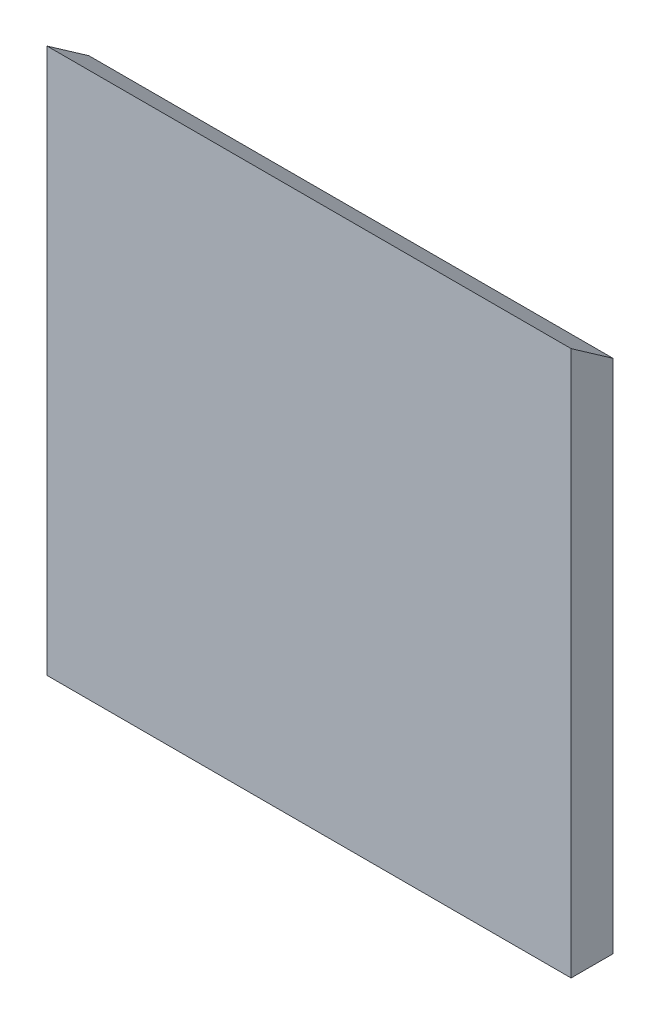
ISO-10303-21;
HEADER;
FILE_DESCRIPTION(('STEP AP214'),'2;1');
FILE_NAME('part.step','',(''),(''),'','','');
FILE_SCHEMA(('AUTOMOTIVE_DESIGN { 1 0 10303 214 1 1 1 1 }'));
ENDSEC;
DATA;
#1=APPLICATION_CONTEXT('core data for automotive mechanical design processes');
#2=APPLICATION_PROTOCOL_DEFINITION('international standard','automotive_design',2000,#1);
#3=PRODUCT_CONTEXT('',#1,'mechanical');
#4=PRODUCT('Part','Part','',(#3));
#5=PRODUCT_RELATED_PRODUCT_CATEGORY('part','',(#4));
#6=PRODUCT_DEFINITION_FORMATION('','',#4);
#7=PRODUCT_DEFINITION_CONTEXT('part definition',#1,'design');
#8=PRODUCT_DEFINITION('design','',#6,#7);
#9=PRODUCT_DEFINITION_SHAPE('','',#8);
#10=(LENGTH_UNIT() NAMED_UNIT(*) SI_UNIT(.MILLI.,.METRE.));
#11=(NAMED_UNIT(*) PLANE_ANGLE_UNIT() SI_UNIT($,.RADIAN.));
#12=(NAMED_UNIT(*) SI_UNIT($,.STERADIAN.) SOLID_ANGLE_UNIT());
#13=UNCERTAINTY_MEASURE_WITH_UNIT(LENGTH_MEASURE(1.E-05),#10,'distance_accuracy_value','');
#14=(GEOMETRIC_REPRESENTATION_CONTEXT(3) GLOBAL_UNCERTAINTY_ASSIGNED_CONTEXT((#13)) GLOBAL_UNIT_ASSIGNED_CONTEXT((#10,
#11,#12)) REPRESENTATION_CONTEXT('',''));
#15=CARTESIAN_POINT('',(0.,0.,0.));
#16=DIRECTION('',(0.,0.,1.));
#17=DIRECTION('',(1.,0.,0.));
#18=AXIS2_PLACEMENT_3D('',#15,#16,#17);
#19=CARTESIAN_POINT('',(0.,0.,10.));
#20=DIRECTION('',(1.,0.,0.));
#21=DIRECTION('',(0.,0.,-1.));
#22=AXIS2_PLACEMENT_3D('',#19,#20,#21);
#23=PLANE('',#22);
#24=DIRECTION('',(0.,-1.,0.));
#25=VECTOR('',#24,1.);
#26=CARTESIAN_POINT('',(0.,0.,10.));
#27=LINE('',#26,#25);
#28=CARTESIAN_POINT('',(0.,130.,10.));
#29=VERTEX_POINT('',#28);
#30=CARTESIAN_POINT('',(0.,0.,10.));
#31=VERTEX_POINT('',#30);
#32=EDGE_CURVE('E87',#29,#31,#27,.T.);
#33=ORIENTED_EDGE('',*,*,#32,.F.);
#34=DIRECTION('',(0.,-0.573576436351046,-0.819152044288992));
#35=VECTOR('',#34,1.);
#36=CARTESIAN_POINT('',(0.,130.,10.));
#37=LINE('',#36,#35);
#38=CARTESIAN_POINT('',(0.,122.997924617903,0.));
#39=VERTEX_POINT('',#38);
#40=EDGE_CURVE('E58',#29,#39,#37,.T.);
#41=ORIENTED_EDGE('',*,*,#40,.T.);
#42=DIRECTION('',(0.,-1.,0.));
#43=VECTOR('',#42,1.);
#44=CARTESIAN_POINT('',(0.,0.,0.));
#45=LINE('',#44,#43);
#46=CARTESIAN_POINT('',(0.,0.,0.));
#47=VERTEX_POINT('',#46);
#48=EDGE_CURVE('E95',#39,#47,#45,.T.);
#49=ORIENTED_EDGE('',*,*,#48,.T.);
#50=DIRECTION('',(0.,0.,-1.));
#51=VECTOR('',#50,1.);
#52=CARTESIAN_POINT('',(0.,0.,10.));
#53=LINE('',#52,#51);
#54=EDGE_CURVE('E80',#31,#47,#53,.T.);
#55=ORIENTED_EDGE('',*,*,#54,.F.);
#56=EDGE_LOOP('',(#33,#41,#49,#55));
#57=FACE_BOUND('',#56,.T.);
#58=ADVANCED_FACE('F35',(#57),#23,.F.);
#59=CARTESIAN_POINT('',(0.,0.,10.));
#60=DIRECTION('',(0.,1.,0.));
#61=DIRECTION('',(0.,0.,1.));
#62=AXIS2_PLACEMENT_3D('',#59,#60,#61);
#63=PLANE('',#62);
#64=DIRECTION('',(1.,0.,0.));
#65=VECTOR('',#64,1.);
#66=CARTESIAN_POINT('',(0.,0.,0.));
#67=LINE('',#66,#65);
#68=CARTESIAN_POINT('',(125.,0.,0.));
#69=VERTEX_POINT('',#68);
#70=EDGE_CURVE('E102',#47,#69,#67,.T.);
#71=ORIENTED_EDGE('',*,*,#70,.T.);
#72=DIRECTION('',(0.,0.,-1.));
#73=VECTOR('',#72,1.);
#74=CARTESIAN_POINT('',(125.,0.,10.));
#75=LINE('',#74,#73);
#76=CARTESIAN_POINT('',(125.,0.,10.));
#77=VERTEX_POINT('',#76);
#78=EDGE_CURVE('E82',#77,#69,#75,.T.);
#79=ORIENTED_EDGE('',*,*,#78,.F.);
#80=DIRECTION('',(1.,0.,0.));
#81=VECTOR('',#80,1.);
#82=CARTESIAN_POINT('',(0.,0.,10.));
#83=LINE('',#82,#81);
#84=EDGE_CURVE('E76',#31,#77,#83,.T.);
#85=ORIENTED_EDGE('',*,*,#84,.F.);
#86=ORIENTED_EDGE('',*,*,#54,.T.);
#87=EDGE_LOOP('',(#71,#79,#85,#86));
#88=FACE_BOUND('',#87,.T.);
#89=ADVANCED_FACE('F78',(#88),#63,.F.);
#90=CARTESIAN_POINT('',(125.,0.,10.));
#91=DIRECTION('',(-1.,0.,0.));
#92=DIRECTION('',(0.,0.,1.));
#93=AXIS2_PLACEMENT_3D('',#90,#91,#92);
#94=PLANE('',#93);
#95=DIRECTION('',(0.,1.,0.));
#96=VECTOR('',#95,1.);
#97=CARTESIAN_POINT('',(125.,0.,0.));
#98=LINE('',#97,#96);
#99=CARTESIAN_POINT('',(125.,122.997924617903,0.));
#100=VERTEX_POINT('',#99);
#101=EDGE_CURVE('E93',#69,#100,#98,.T.);
#102=ORIENTED_EDGE('',*,*,#101,.T.);
#103=DIRECTION('',(0.,0.573576436351046,0.819152044288992));
#104=VECTOR('',#103,1.);
#105=CARTESIAN_POINT('',(125.,130.,10.));
#106=LINE('',#105,#104);
#107=CARTESIAN_POINT('',(125.,130.,10.));
#108=VERTEX_POINT('',#107);
#109=EDGE_CURVE('E11',#100,#108,#106,.T.);
#110=ORIENTED_EDGE('',*,*,#109,.T.);
#111=DIRECTION('',(0.,1.,0.));
#112=VECTOR('',#111,1.);
#113=CARTESIAN_POINT('',(125.,0.,10.));
#114=LINE('',#113,#112);
#115=EDGE_CURVE('E86',#77,#108,#114,.T.);
#116=ORIENTED_EDGE('',*,*,#115,.F.);
#117=ORIENTED_EDGE('',*,*,#78,.T.);
#118=EDGE_LOOP('',(#102,#110,#116,#117));
#119=FACE_BOUND('',#118,.T.);
#120=ADVANCED_FACE('F109',(#119),#94,.F.);
#121=CARTESIAN_POINT('',(0.,0.,10.));
#122=DIRECTION('',(0.,0.,-1.));
#123=DIRECTION('',(-1.,0.,0.));
#124=AXIS2_PLACEMENT_3D('',#121,#122,#123);
#125=PLANE('',#124);
#126=ORIENTED_EDGE('',*,*,#32,.T.);
#127=ORIENTED_EDGE('',*,*,#84,.T.);
#128=ORIENTED_EDGE('',*,*,#115,.T.);
#129=DIRECTION('',(-1.,0.,0.));
#130=VECTOR('',#129,1.);
#131=CARTESIAN_POINT('',(0.,130.,10.));
#132=LINE('',#131,#130);
#133=EDGE_CURVE('E92',#108,#29,#132,.T.);
#134=ORIENTED_EDGE('',*,*,#133,.T.);
#135=EDGE_LOOP('',(#126,#127,#128,#134));
#136=FACE_BOUND('',#135,.T.);
#137=ADVANCED_FACE('F90',(#136),#125,.F.);
#138=CARTESIAN_POINT('',(0.,0.,0.));
#139=DIRECTION('',(0.,0.,-1.));
#140=DIRECTION('',(-1.,0.,0.));
#141=AXIS2_PLACEMENT_3D('',#138,#139,#140);
#142=PLANE('',#141);
#143=ORIENTED_EDGE('',*,*,#48,.F.);
#144=DIRECTION('',(1.,0.,0.));
#145=VECTOR('',#144,1.);
#146=CARTESIAN_POINT('',(125.,122.997924617903,0.));
#147=LINE('',#146,#145);
#148=EDGE_CURVE('E44',#39,#100,#147,.T.);
#149=ORIENTED_EDGE('',*,*,#148,.T.);
#150=ORIENTED_EDGE('',*,*,#101,.F.);
#151=ORIENTED_EDGE('',*,*,#70,.F.);
#152=EDGE_LOOP('',(#143,#149,#150,#151));
#153=FACE_BOUND('',#152,.T.);
#154=ADVANCED_FACE('F110',(#153),#142,.T.);
#155=CARTESIAN_POINT('',(0.,130.,10.));
#156=DIRECTION('',(0.,0.819152044288992,-0.573576436351046));
#157=DIRECTION('',(1.,0.,0.));
#158=AXIS2_PLACEMENT_3D('',#155,#156,#157);
#159=PLANE('',#158);
#160=ORIENTED_EDGE('',*,*,#109,.F.);
#161=ORIENTED_EDGE('',*,*,#148,.F.);
#162=ORIENTED_EDGE('',*,*,#40,.F.);
#163=ORIENTED_EDGE('',*,*,#133,.F.);
#164=EDGE_LOOP('',(#160,#161,#162,#163));
#165=FACE_BOUND('',#164,.T.);
#166=ADVANCED_FACE('F38',(#165),#159,.T.);
#167=CLOSED_SHELL('',(#58,#89,#120,#137,#154,#166));
#168=MANIFOLD_SOLID_BREP('B2',#167);
#169=ADVANCED_BREP_SHAPE_REPRESENTATION('',(#18,#168),#14);
#170=SHAPE_DEFINITION_REPRESENTATION(#9,#169);
ENDSEC;
END-ISO-10303-21;
